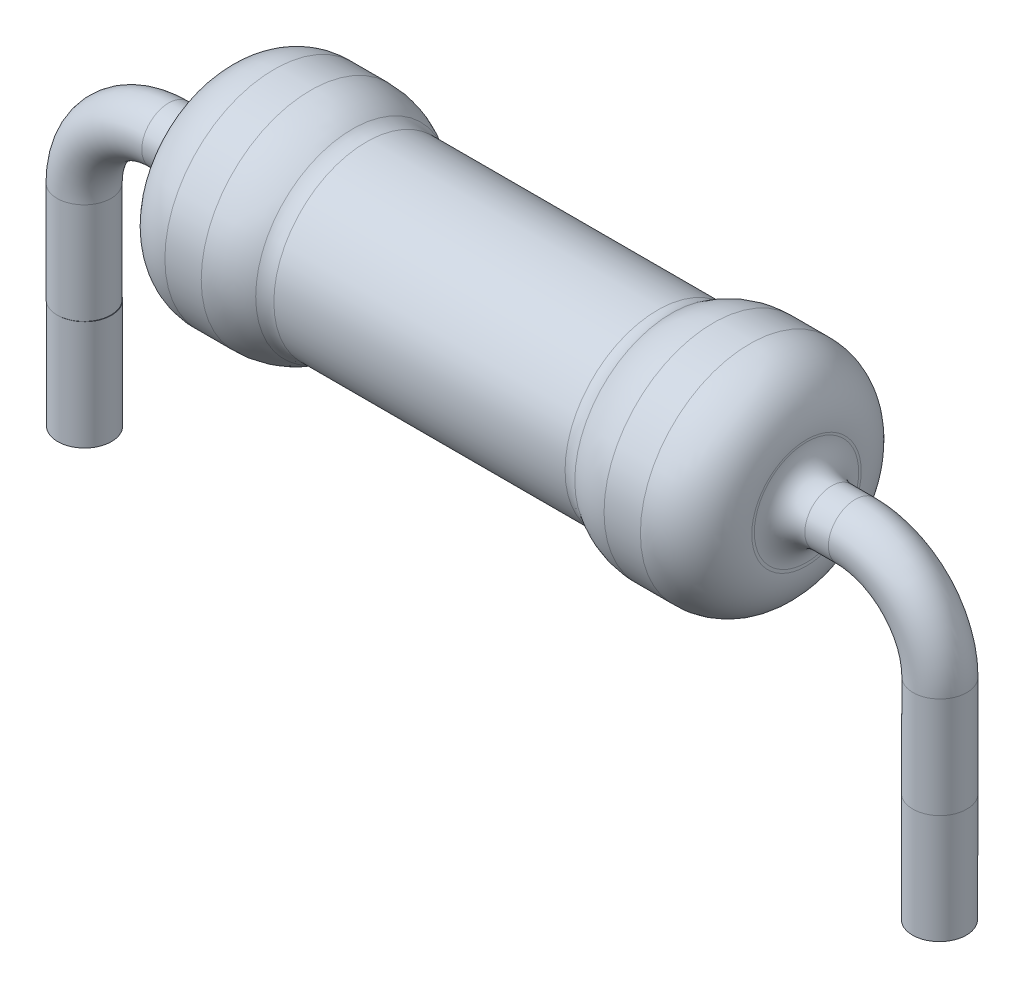
ISO-10303-21;
HEADER;
FILE_DESCRIPTION(('STEP AP214'),'2;1');
FILE_NAME('part.step','',(''),(''),'','','');
FILE_SCHEMA(('AUTOMOTIVE_DESIGN { 1 0 10303 214 1 1 1 1 }'));
ENDSEC;
DATA;
#1=APPLICATION_CONTEXT('core data for automotive mechanical design processes');
#2=APPLICATION_PROTOCOL_DEFINITION('international standard','automotive_design',2000,#1);
#3=PRODUCT_CONTEXT('',#1,'mechanical');
#4=PRODUCT('Part','Part','',(#3));
#5=PRODUCT_RELATED_PRODUCT_CATEGORY('part','',(#4));
#6=PRODUCT_DEFINITION_FORMATION('','',#4);
#7=PRODUCT_DEFINITION_CONTEXT('part definition',#1,'design');
#8=PRODUCT_DEFINITION('design','',#6,#7);
#9=PRODUCT_DEFINITION_SHAPE('','',#8);
#10=(LENGTH_UNIT() NAMED_UNIT(*) SI_UNIT(.MILLI.,.METRE.));
#11=(NAMED_UNIT(*) PLANE_ANGLE_UNIT() SI_UNIT($,.RADIAN.));
#12=(NAMED_UNIT(*) SI_UNIT($,.STERADIAN.) SOLID_ANGLE_UNIT());
#13=UNCERTAINTY_MEASURE_WITH_UNIT(LENGTH_MEASURE(1.E-05),#10,'distance_accuracy_value','');
#14=(GEOMETRIC_REPRESENTATION_CONTEXT(3) GLOBAL_UNCERTAINTY_ASSIGNED_CONTEXT((#13)) GLOBAL_UNIT_ASSIGNED_CONTEXT((#10,
#11,#12)) REPRESENTATION_CONTEXT('',''));
#15=CARTESIAN_POINT('',(0.,0.,0.));
#16=DIRECTION('',(0.,0.,1.));
#17=DIRECTION('',(1.,0.,0.));
#18=AXIS2_PLACEMENT_3D('',#15,#16,#17);
#19=CARTESIAN_POINT('',(5.08,5.3,0.));
#20=DIRECTION('',(0.,-1.,0.));
#21=DIRECTION('',(0.,0.,-1.));
#22=AXIS2_PLACEMENT_3D('',#19,#20,#21);
#23=CYLINDRICAL_SURFACE('',#22,0.32);
#24=CARTESIAN_POINT('',(5.08595401109108,5.3,0.));
#25=DIRECTION('',(0.,1.,0.));
#26=DIRECTION('',(-0.0186014552957771,0.,0.999826977962127));
#27=AXIS2_PLACEMENT_3D('',#24,#25,#26);
#28=CIRCLE('',#27,0.32);
#29=CARTESIAN_POINT('',(5.08000111603339,5.3,0.319972319800025));
#30=VERTEX_POINT('',#29);
#31=CARTESIAN_POINT('',(5.40297700554554,5.3,0.));
#32=VERTEX_POINT('',#31);
#33=EDGE_CURVE('E109',#30,#32,#28,.T.);
#34=ORIENTED_EDGE('',*,*,#33,.F.);
#35=CARTESIAN_POINT('',(5.08,5.3,0.));
#36=DIRECTION('',(0.,-1.,0.));
#37=DIRECTION('',(0.,0.,1.));
#38=AXIS2_PLACEMENT_3D('',#35,#36,#37);
#39=CIRCLE('',#38,0.32);
#40=CARTESIAN_POINT('',(4.76297700554554,5.3,0.));
#41=VERTEX_POINT('',#40);
#42=EDGE_CURVE('E98',#30,#41,#39,.T.);
#43=ORIENTED_EDGE('',*,*,#42,.T.);
#44=CARTESIAN_POINT('',(5.08,5.3,0.));
#45=DIRECTION('',(0.,-1.,0.));
#46=DIRECTION('',(-1.,0.,-1.66793845883752E-13));
#47=AXIS2_PLACEMENT_3D('',#44,#45,#46);
#48=CIRCLE('',#47,0.32);
#49=CARTESIAN_POINT('',(5.08000051517671,5.3,-0.319972311682629));
#50=VERTEX_POINT('',#49);
#51=EDGE_CURVE('E92',#41,#50,#48,.T.);
#52=ORIENTED_EDGE('',*,*,#51,.T.);
#53=CARTESIAN_POINT('',(5.08595401109108,5.3,0.));
#54=DIRECTION('',(0.,1.,0.));
#55=DIRECTION('',(1.,0.,0.));
#56=AXIS2_PLACEMENT_3D('',#53,#54,#55);
#57=CIRCLE('',#56,0.32);
#58=EDGE_CURVE('E101',#32,#50,#57,.T.);
#59=ORIENTED_EDGE('',*,*,#58,.F.);
#60=EDGE_LOOP('',(#34,#43,#52,#59));
#61=FACE_BOUND('',#60,.T.);
#62=CARTESIAN_POINT('',(5.08,4.,0.));
#63=DIRECTION('',(0.,-1.,0.));
#64=DIRECTION('',(0.,0.,-1.));
#65=AXIS2_PLACEMENT_3D('',#62,#63,#64);
#66=CIRCLE('',#65,0.32);
#67=CARTESIAN_POINT('',(5.08,4.,-0.319999999999999));
#68=VERTEX_POINT('',#67);
#69=EDGE_CURVE('E45',#68,#68,#66,.F.);
#70=ORIENTED_EDGE('',*,*,#69,.T.);
#71=EDGE_LOOP('',(#70));
#72=FACE_BOUND('',#71,.T.);
#73=ADVANCED_FACE('F41',(#61,#72),#23,.T.);
#74=CARTESIAN_POINT('',(-5.08595401109108,5.3,0.));
#75=DIRECTION('',(0.,1.,0.));
#76=DIRECTION('',(0.,0.,1.));
#77=AXIS2_PLACEMENT_3D('',#74,#75,#76);
#78=PLANE('',#77);
#79=CARTESIAN_POINT('',(-5.08595401109108,5.3,0.));
#80=DIRECTION('',(0.,-1.,0.));
#81=DIRECTION('',(1.,0.,0.));
#82=AXIS2_PLACEMENT_3D('',#79,#80,#81);
#83=CIRCLE('',#82,0.32);
#84=CARTESIAN_POINT('',(-4.76595401109108,5.3,0.));
#85=VERTEX_POINT('',#84);
#86=EDGE_CURVE('E231',#85,#85,#83,.F.);
#87=ORIENTED_EDGE('',*,*,#86,.F.);
#88=EDGE_LOOP('',(#87));
#89=FACE_BOUND('',#88,.T.);
#90=ADVANCED_FACE('F138',(#89),#78,.F.);
#91=CARTESIAN_POINT('',(5.08595401109108,6.5,0.));
#92=DIRECTION('',(0.,-1.,0.));
#93=DIRECTION('',(1.,0.,0.));
#94=AXIS2_PLACEMENT_3D('',#91,#92,#93);
#95=CYLINDRICAL_SURFACE('',#94,0.32);
#96=ORIENTED_EDGE('',*,*,#51,.F.);
#97=ORIENTED_EDGE('',*,*,#42,.F.);
#98=ORIENTED_EDGE('',*,*,#33,.T.);
#99=ORIENTED_EDGE('',*,*,#58,.T.);
#100=EDGE_LOOP('',(#96,#97,#98,#99));
#101=FACE_BOUND('',#100,.T.);
#102=CARTESIAN_POINT('',(5.08595401109107,6.5,0.));
#103=DIRECTION('',(0.,1.,0.));
#104=DIRECTION('',(1.,0.,0.));
#105=AXIS2_PLACEMENT_3D('',#102,#103,#104);
#106=CIRCLE('',#105,0.32);
#107=CARTESIAN_POINT('',(5.40595401109107,6.5,0.));
#108=VERTEX_POINT('',#107);
#109=EDGE_CURVE('E229',#108,#108,#106,.T.);
#110=ORIENTED_EDGE('',*,*,#109,.F.);
#111=EDGE_LOOP('',(#110));
#112=FACE_BOUND('',#111,.T.);
#113=ADVANCED_FACE('F95',(#101,#112),#95,.T.);
#114=CARTESIAN_POINT('',(-5.08595401109108,6.5,0.));
#115=DIRECTION('',(0.,-1.,0.));
#116=DIRECTION('',(1.,0.,0.));
#117=AXIS2_PLACEMENT_3D('',#114,#115,#116);
#118=CYLINDRICAL_SURFACE('',#117,0.32);
#119=CARTESIAN_POINT('',(-5.08595401109107,6.5,0.));
#120=DIRECTION('',(0.,1.,0.));
#121=DIRECTION('',(-1.,0.,0.));
#122=AXIS2_PLACEMENT_3D('',#119,#120,#121);
#123=CIRCLE('',#122,0.32);
#124=CARTESIAN_POINT('',(-5.40595401109107,6.5,0.));
#125=VERTEX_POINT('',#124);
#126=EDGE_CURVE('E226',#125,#125,#123,.T.);
#127=ORIENTED_EDGE('',*,*,#126,.F.);
#128=EDGE_LOOP('',(#127));
#129=FACE_BOUND('',#128,.T.);
#130=ORIENTED_EDGE('',*,*,#86,.T.);
#131=EDGE_LOOP('',(#130));
#132=FACE_BOUND('',#131,.T.);
#133=ADVANCED_FACE('F137',(#129,#132),#118,.T.);
#134=CARTESIAN_POINT('',(4.08,6.5,0.));
#135=DIRECTION('',(0.,0.,1.));
#136=DIRECTION('',(1.,0.,0.));
#137=AXIS2_PLACEMENT_3D('',#134,#135,#136);
#138=TOROIDAL_SURFACE('',#137,1.00595401109108,0.32);
#139=CARTESIAN_POINT('',(4.08,7.50595401109108,0.));
#140=DIRECTION('',(-1.,0.,0.));
#141=DIRECTION('',(0.,-1.,0.));
#142=AXIS2_PLACEMENT_3D('',#139,#140,#141);
#143=CIRCLE('',#142,0.32);
#144=CARTESIAN_POINT('',(4.08,7.18595401109108,0.));
#145=VERTEX_POINT('',#144);
#146=EDGE_CURVE('E212',#145,#145,#143,.T.);
#147=ORIENTED_EDGE('',*,*,#146,.F.);
#148=EDGE_LOOP('',(#147));
#149=FACE_BOUND('',#148,.T.);
#150=ORIENTED_EDGE('',*,*,#109,.T.);
#151=EDGE_LOOP('',(#150));
#152=FACE_BOUND('',#151,.T.);
#153=ADVANCED_FACE('F220',(#149,#152),#138,.T.);
#154=CARTESIAN_POINT('',(-4.08,6.5,0.));
#155=DIRECTION('',(0.,0.,-1.));
#156=DIRECTION('',(-1.,0.,0.));
#157=AXIS2_PLACEMENT_3D('',#154,#155,#156);
#158=TOROIDAL_SURFACE('',#157,1.00595401109108,0.32);
#159=CARTESIAN_POINT('',(-4.08,7.50595401109108,0.));
#160=DIRECTION('',(1.,0.,0.));
#161=DIRECTION('',(0.,1.,0.));
#162=AXIS2_PLACEMENT_3D('',#159,#160,#161);
#163=CIRCLE('',#162,0.320000000000001);
#164=CARTESIAN_POINT('',(-4.08,7.82595401109108,0.));
#165=VERTEX_POINT('',#164);
#166=EDGE_CURVE('E209',#165,#165,#163,.T.);
#167=ORIENTED_EDGE('',*,*,#166,.F.);
#168=EDGE_LOOP('',(#167));
#169=FACE_BOUND('',#168,.T.);
#170=ORIENTED_EDGE('',*,*,#126,.T.);
#171=EDGE_LOOP('',(#170));
#172=FACE_BOUND('',#171,.T.);
#173=ADVANCED_FACE('F217',(#169,#172),#158,.T.);
#174=CARTESIAN_POINT('',(4.08,7.50595401109108,0.));
#175=DIRECTION('',(-1.,0.,0.));
#176=DIRECTION('',(0.,-1.,0.));
#177=AXIS2_PLACEMENT_3D('',#174,#175,#176);
#178=CYLINDRICAL_SURFACE('',#177,0.32);
#179=CARTESIAN_POINT('',(3.8,7.50595401109108,0.));
#180=DIRECTION('',(1.,0.,0.));
#181=DIRECTION('',(0.,0.,-1.));
#182=AXIS2_PLACEMENT_3D('',#179,#180,#181);
#183=CIRCLE('',#182,0.32);
#184=CARTESIAN_POINT('',(3.8,7.50595401109108,-0.32));
#185=VERTEX_POINT('',#184);
#186=EDGE_CURVE('E206',#185,#185,#183,.T.);
#187=ORIENTED_EDGE('',*,*,#186,.T.);
#188=EDGE_LOOP('',(#187));
#189=FACE_BOUND('',#188,.T.);
#190=ORIENTED_EDGE('',*,*,#146,.T.);
#191=EDGE_LOOP('',(#190));
#192=FACE_BOUND('',#191,.T.);
#193=ADVANCED_FACE('F219',(#189,#192),#178,.T.);
#194=CARTESIAN_POINT('',(-4.08,7.50595401109108,0.));
#195=DIRECTION('',(1.,0.,0.));
#196=DIRECTION('',(0.,1.,0.));
#197=AXIS2_PLACEMENT_3D('',#194,#195,#196);
#198=CYLINDRICAL_SURFACE('',#197,0.320000000000001);
#199=ORIENTED_EDGE('',*,*,#166,.T.);
#200=EDGE_LOOP('',(#199));
#201=FACE_BOUND('',#200,.T.);
#202=CARTESIAN_POINT('',(-3.8,7.50595401109108,0.));
#203=DIRECTION('',(1.,0.,0.));
#204=DIRECTION('',(0.,0.,-1.));
#205=AXIS2_PLACEMENT_3D('',#202,#203,#204);
#206=CIRCLE('',#205,0.32);
#207=CARTESIAN_POINT('',(-3.8,7.50595401109108,-0.32));
#208=VERTEX_POINT('',#207);
#209=EDGE_CURVE('E197',#208,#208,#206,.F.);
#210=ORIENTED_EDGE('',*,*,#209,.T.);
#211=EDGE_LOOP('',(#210));
#212=FACE_BOUND('',#211,.T.);
#213=ADVANCED_FACE('F176',(#201,#212),#198,.T.);
#214=CARTESIAN_POINT('',(3.8,7.50595401109108,0.));
#215=DIRECTION('',(1.,0.,0.));
#216=DIRECTION('',(0.,0.,-1.));
#217=AXIS2_PLACEMENT_3D('',#214,#215,#216);
#218=TOROIDAL_SURFACE('',#217,0.62,0.3);
#219=ORIENTED_EDGE('',*,*,#186,.F.);
#220=EDGE_LOOP('',(#219));
#221=FACE_BOUND('',#220,.T.);
#222=CARTESIAN_POINT('',(3.5,7.50595401109108,0.));
#223=DIRECTION('',(1.,0.,0.));
#224=DIRECTION('',(0.,0.,1.));
#225=AXIS2_PLACEMENT_3D('',#222,#223,#224);
#226=CIRCLE('',#225,0.62);
#227=CARTESIAN_POINT('',(3.5,7.50595401109108,-0.62));
#228=VERTEX_POINT('',#227);
#229=CARTESIAN_POINT('',(3.5,7.50595401109108,0.62));
#230=VERTEX_POINT('',#229);
#231=EDGE_CURVE('E205',#228,#230,#226,.F.);
#232=ORIENTED_EDGE('',*,*,#231,.F.);
#233=CARTESIAN_POINT('',(3.5,7.50595401109108,0.));
#234=DIRECTION('',(1.,0.,0.));
#235=DIRECTION('',(0.,0.,-1.));
#236=AXIS2_PLACEMENT_3D('',#233,#234,#235);
#237=CIRCLE('',#236,0.62);
#238=EDGE_CURVE('E192',#230,#228,#237,.F.);
#239=ORIENTED_EDGE('',*,*,#238,.F.);
#240=EDGE_LOOP('',(#232,#239));
#241=FACE_BOUND('',#240,.T.);
#242=ADVANCED_FACE('F164',(#221,#241),#218,.F.);
#243=CARTESIAN_POINT('',(-3.8,7.50595401109108,0.));
#244=DIRECTION('',(1.,0.,0.));
#245=DIRECTION('',(0.,0.,-1.));
#246=AXIS2_PLACEMENT_3D('',#243,#244,#245);
#247=TOROIDAL_SURFACE('',#246,0.62,0.3);
#248=CARTESIAN_POINT('',(-3.5,7.50595401109108,0.));
#249=DIRECTION('',(-1.,0.,0.));
#250=DIRECTION('',(0.,0.,1.));
#251=AXIS2_PLACEMENT_3D('',#248,#249,#250);
#252=CIRCLE('',#251,0.62);
#253=CARTESIAN_POINT('',(-3.5,7.50595401109108,0.62));
#254=VERTEX_POINT('',#253);
#255=CARTESIAN_POINT('',(-3.5,7.50595401109108,-0.62));
#256=VERTEX_POINT('',#255);
#257=EDGE_CURVE('E376',#254,#256,#252,.T.);
#258=ORIENTED_EDGE('',*,*,#257,.T.);
#259=CARTESIAN_POINT('',(-3.5,7.50595401109108,0.));
#260=DIRECTION('',(-1.,0.,0.));
#261=DIRECTION('',(0.,0.,-1.));
#262=AXIS2_PLACEMENT_3D('',#259,#260,#261);
#263=CIRCLE('',#262,0.62);
#264=EDGE_CURVE('E273',#256,#254,#263,.T.);
#265=ORIENTED_EDGE('',*,*,#264,.T.);
#266=EDGE_LOOP('',(#258,#265));
#267=FACE_BOUND('',#266,.T.);
#268=ORIENTED_EDGE('',*,*,#209,.F.);
#269=EDGE_LOOP('',(#268));
#270=FACE_BOUND('',#269,.T.);
#271=ADVANCED_FACE('F175',(#267,#270),#247,.F.);
#272=CARTESIAN_POINT('',(3.5,0.,0.));
#273=DIRECTION('',(1.,0.,0.));
#274=DIRECTION('',(0.,0.,-1.));
#275=AXIS2_PLACEMENT_3D('',#272,#273,#274);
#276=PLANE('',#275);
#277=CARTESIAN_POINT('',(3.5,7.50030887078089,0.));
#278=DIRECTION('',(-1.,0.,0.));
#279=DIRECTION('',(0.,0.,1.));
#280=AXIS2_PLACEMENT_3D('',#277,#278,#279);
#281=CIRCLE('',#280,0.650453186138384);
#282=CARTESIAN_POINT('',(3.5,7.50030887078089,0.650453186138384));
#283=VERTEX_POINT('',#282);
#284=CARTESIAN_POINT('',(3.5,7.50030887078089,-0.650453186138384));
#285=VERTEX_POINT('',#284);
#286=EDGE_CURVE('E346',#283,#285,#281,.T.);
#287=ORIENTED_EDGE('',*,*,#286,.F.);
#288=CARTESIAN_POINT('',(3.5,7.50030887078089,0.));
#289=DIRECTION('',(-1.,0.,0.));
#290=DIRECTION('',(0.,0.,-1.));
#291=AXIS2_PLACEMENT_3D('',#288,#289,#290);
#292=CIRCLE('',#291,0.650453186138384);
#293=EDGE_CURVE('E356',#285,#283,#292,.T.);
#294=ORIENTED_EDGE('',*,*,#293,.F.);
#295=EDGE_LOOP('',(#287,#294));
#296=FACE_BOUND('',#295,.T.);
#297=ORIENTED_EDGE('',*,*,#231,.T.);
#298=ORIENTED_EDGE('',*,*,#238,.T.);
#299=EDGE_LOOP('',(#297,#298));
#300=FACE_BOUND('',#299,.T.);
#301=ADVANCED_FACE('F286',(#296,#300),#276,.T.);
#302=CARTESIAN_POINT('',(-3.5,0.,0.));
#303=DIRECTION('',(1.,0.,0.));
#304=DIRECTION('',(0.,0.,-1.));
#305=AXIS2_PLACEMENT_3D('',#302,#303,#304);
#306=PLANE('',#305);
#307=CARTESIAN_POINT('',(-3.5,7.50030887078089,0.));
#308=DIRECTION('',(1.,0.,0.));
#309=DIRECTION('',(0.,0.,1.));
#310=AXIS2_PLACEMENT_3D('',#307,#308,#309);
#311=CIRCLE('',#310,0.650453186138384);
#312=CARTESIAN_POINT('',(-3.5,7.50030887078089,0.650453186138384));
#313=VERTEX_POINT('',#312);
#314=CARTESIAN_POINT('',(-3.5,7.50030887078089,-0.650453186138384));
#315=VERTEX_POINT('',#314);
#316=EDGE_CURVE('E59',#313,#315,#311,.T.);
#317=ORIENTED_EDGE('',*,*,#316,.F.);
#318=CARTESIAN_POINT('',(-3.5,7.50030887078089,0.));
#319=DIRECTION('',(1.,0.,0.));
#320=DIRECTION('',(0.,0.,-1.));
#321=AXIS2_PLACEMENT_3D('',#318,#319,#320);
#322=CIRCLE('',#321,0.650453186138384);
#323=EDGE_CURVE('E303',#315,#313,#322,.T.);
#324=ORIENTED_EDGE('',*,*,#323,.F.);
#325=EDGE_LOOP('',(#317,#324));
#326=FACE_BOUND('',#325,.T.);
#327=ORIENTED_EDGE('',*,*,#264,.F.);
#328=ORIENTED_EDGE('',*,*,#257,.F.);
#329=EDGE_LOOP('',(#327,#328));
#330=FACE_BOUND('',#329,.T.);
#331=ADVANCED_FACE('F278',(#326,#330),#306,.F.);
#332=CARTESIAN_POINT('',(2.85,7.50030887078089,0.));
#333=DIRECTION('',(-1.,0.,0.));
#334=DIRECTION('',(0.,0.,1.));
#335=AXIS2_PLACEMENT_3D('',#332,#333,#334);
#336=TOROIDAL_SURFACE('',#335,0.650453186138384,0.65);
#337=CARTESIAN_POINT('',(2.82573198396603,7.50030887078089,0.));
#338=DIRECTION('',(-1.,0.,0.));
#339=DIRECTION('',(0.,0.,1.));
#340=AXIS2_PLACEMENT_3D('',#337,#338,#339);
#341=CIRCLE('',#340,1.3);
#342=CARTESIAN_POINT('',(2.82573198396603,7.50030887078089,1.3));
#343=VERTEX_POINT('',#342);
#344=EDGE_CURVE('E265',#343,#343,#341,.T.);
#345=ORIENTED_EDGE('',*,*,#344,.F.);
#346=EDGE_LOOP('',(#345));
#347=FACE_BOUND('',#346,.T.);
#348=ORIENTED_EDGE('',*,*,#286,.T.);
#349=ORIENTED_EDGE('',*,*,#293,.T.);
#350=EDGE_LOOP('',(#348,#349));
#351=FACE_BOUND('',#350,.T.);
#352=ADVANCED_FACE('F256',(#347,#351),#336,.T.);
#353=CARTESIAN_POINT('',(-2.85,7.50030887078089,0.));
#354=DIRECTION('',(-1.,0.,0.));
#355=DIRECTION('',(0.,0.,1.));
#356=AXIS2_PLACEMENT_3D('',#353,#354,#355);
#357=TOROIDAL_SURFACE('',#356,0.650453186138384,0.65);
#358=ORIENTED_EDGE('',*,*,#316,.T.);
#359=ORIENTED_EDGE('',*,*,#323,.T.);
#360=EDGE_LOOP('',(#358,#359));
#361=FACE_BOUND('',#360,.T.);
#362=CARTESIAN_POINT('',(-2.82573198396603,7.50030887078089,0.));
#363=DIRECTION('',(-1.,0.,0.));
#364=DIRECTION('',(0.,0.,1.));
#365=AXIS2_PLACEMENT_3D('',#362,#363,#364);
#366=CIRCLE('',#365,1.3);
#367=CARTESIAN_POINT('',(-2.82573198396603,7.50030887078089,1.3));
#368=VERTEX_POINT('',#367);
#369=EDGE_CURVE('E315',#368,#368,#366,.F.);
#370=ORIENTED_EDGE('',*,*,#369,.F.);
#371=EDGE_LOOP('',(#370));
#372=FACE_BOUND('',#371,.T.);
#373=ADVANCED_FACE('F244',(#361,#372),#357,.T.);
#374=CARTESIAN_POINT('',(-3.5,7.50030887078089,0.));
#375=DIRECTION('',(-1.,0.,0.));
#376=DIRECTION('',(0.,0.,1.));
#377=AXIS2_PLACEMENT_3D('',#374,#375,#376);
#378=CYLINDRICAL_SURFACE('',#377,1.3);
#379=CARTESIAN_POINT('',(2.39370640790275,7.50030887078089,0.));
#380=DIRECTION('',(-1.,0.,0.));
#381=DIRECTION('',(0.,0.,1.));
#382=AXIS2_PLACEMENT_3D('',#379,#380,#381);
#383=CIRCLE('',#382,1.3);
#384=CARTESIAN_POINT('',(2.39370640790275,7.50030887078089,1.3));
#385=VERTEX_POINT('',#384);
#386=EDGE_CURVE('E323',#385,#385,#383,.T.);
#387=ORIENTED_EDGE('',*,*,#386,.F.);
#388=EDGE_LOOP('',(#387));
#389=FACE_BOUND('',#388,.T.);
#390=ORIENTED_EDGE('',*,*,#344,.T.);
#391=EDGE_LOOP('',(#390));
#392=FACE_BOUND('',#391,.T.);
#393=ADVANCED_FACE('F255',(#389,#392),#378,.T.);
#394=CARTESIAN_POINT('',(-3.5,7.50030887078089,0.));
#395=DIRECTION('',(-1.,0.,0.));
#396=DIRECTION('',(0.,0.,1.));
#397=AXIS2_PLACEMENT_3D('',#394,#395,#396);
#398=CYLINDRICAL_SURFACE('',#397,1.3);
#399=ORIENTED_EDGE('',*,*,#369,.T.);
#400=EDGE_LOOP('',(#399));
#401=FACE_BOUND('',#400,.T.);
#402=CARTESIAN_POINT('',(-2.39370640790275,7.50030887078089,0.));
#403=DIRECTION('',(-1.,0.,0.));
#404=DIRECTION('',(0.,0.,1.));
#405=AXIS2_PLACEMENT_3D('',#402,#403,#404);
#406=CIRCLE('',#405,1.3);
#407=CARTESIAN_POINT('',(-2.39370640790275,7.50030887078089,1.3));
#408=VERTEX_POINT('',#407);
#409=EDGE_CURVE('E421',#408,#408,#406,.F.);
#410=ORIENTED_EDGE('',*,*,#409,.F.);
#411=EDGE_LOOP('',(#410));
#412=FACE_BOUND('',#411,.T.);
#413=ADVANCED_FACE('F431',(#401,#412),#398,.T.);
#414=CARTESIAN_POINT('',(2.39370640790275,7.50030887078089,0.4));
#415=DIRECTION('',(0.,1.,0.));
#416=DIRECTION('',(0.,0.,1.));
#417=AXIS2_PLACEMENT_3D('',#414,#415,#416);
#418=CIRCLE('',#417,0.899999999999999);
#419=TRIMMED_CURVE('',#418,(PARAMETER_VALUE(-2.03135031847622)),
(PARAMETER_VALUE(2.03135031847622)),.T.,.PARAMETER.);
#420=CARTESIAN_POINT('',(2.39370640790275,7.50030887078089,0.));
#421=DIRECTION('',(-1.,0.,0.));
#422=AXIS1_PLACEMENT('',#420,#421);
#423=SURFACE_OF_REVOLUTION('',#419,#422);
#424=CARTESIAN_POINT('',(1.89621268934944,7.50030887078089,0.));
#425=DIRECTION('',(-1.,0.,0.));
#426=DIRECTION('',(0.,0.,1.));
#427=AXIS2_PLACEMENT_3D('',#424,#425,#426);
#428=CIRCLE('',#427,1.15);
#429=CARTESIAN_POINT('',(1.89621268934944,7.50030887078089,1.15));
#430=VERTEX_POINT('',#429);
#431=EDGE_CURVE('E416',#430,#430,#428,.F.);
#432=ORIENTED_EDGE('',*,*,#431,.T.);
#433=EDGE_LOOP('',(#432));
#434=FACE_BOUND('',#433,.T.);
#435=ORIENTED_EDGE('',*,*,#386,.T.);
#436=EDGE_LOOP('',(#435));
#437=FACE_BOUND('',#436,.T.);
#438=ADVANCED_FACE('F428',(#434,#437),#423,.F.);
#439=CARTESIAN_POINT('',(-2.39370640790275,7.50030887078089,0.4));
#440=DIRECTION('',(0.,1.,0.));
#441=DIRECTION('',(0.,0.,1.));
#442=AXIS2_PLACEMENT_3D('',#439,#440,#441);
#443=CIRCLE('',#442,0.899999999999999);
#444=TRIMMED_CURVE('',#443,(PARAMETER_VALUE(-2.03135031847622)),
(PARAMETER_VALUE(2.03135031847622)),.T.,.PARAMETER.);
#445=CARTESIAN_POINT('',(-2.39370640790275,7.50030887078089,0.));
#446=DIRECTION('',(-1.,0.,0.));
#447=AXIS1_PLACEMENT('',#445,#446);
#448=SURFACE_OF_REVOLUTION('',#444,#447);
#449=ORIENTED_EDGE('',*,*,#409,.T.);
#450=EDGE_LOOP('',(#449));
#451=FACE_BOUND('',#450,.T.);
#452=CARTESIAN_POINT('',(-1.89621268934944,7.50030887078089,0.));
#453=DIRECTION('',(-1.,0.,0.));
#454=DIRECTION('',(0.,0.,1.));
#455=AXIS2_PLACEMENT_3D('',#452,#453,#454);
#456=CIRCLE('',#455,1.15);
#457=CARTESIAN_POINT('',(-1.89621268934944,7.50030887078089,1.15));
#458=VERTEX_POINT('',#457);
#459=EDGE_CURVE('E414',#458,#458,#456,.T.);
#460=ORIENTED_EDGE('',*,*,#459,.T.);
#461=EDGE_LOOP('',(#460));
#462=FACE_BOUND('',#461,.T.);
#463=ADVANCED_FACE('F425',(#451,#462),#448,.F.);
#464=CARTESIAN_POINT('',(1.73038144983167,7.50030887078089,0.));
#465=DIRECTION('',(-1.,0.,0.));
#466=DIRECTION('',(0.,0.,1.));
#467=AXIS2_PLACEMENT_3D('',#464,#465,#466);
#468=TOROIDAL_SURFACE('',#467,1.4,0.3);
#469=CARTESIAN_POINT('',(1.73038144983167,7.50030887078089,0.));
#470=DIRECTION('',(-1.,0.,0.));
#471=DIRECTION('',(0.,0.,1.));
#472=AXIS2_PLACEMENT_3D('',#469,#470,#471);
#473=CIRCLE('',#472,1.1);
#474=CARTESIAN_POINT('',(1.73038144983167,7.50030887078089,1.1));
#475=VERTEX_POINT('',#474);
#476=EDGE_CURVE('E51',#475,#475,#473,.T.);
#477=ORIENTED_EDGE('',*,*,#476,.F.);
#478=EDGE_LOOP('',(#477));
#479=FACE_BOUND('',#478,.T.);
#480=ORIENTED_EDGE('',*,*,#431,.F.);
#481=EDGE_LOOP('',(#480));
#482=FACE_BOUND('',#481,.T.);
#483=ADVANCED_FACE('F403',(#479,#482),#468,.F.);
#484=CARTESIAN_POINT('',(-1.73038144983167,7.50030887078089,0.));
#485=DIRECTION('',(-1.,0.,0.));
#486=DIRECTION('',(0.,0.,1.));
#487=AXIS2_PLACEMENT_3D('',#484,#485,#486);
#488=TOROIDAL_SURFACE('',#487,1.4,0.3);
#489=ORIENTED_EDGE('',*,*,#459,.F.);
#490=EDGE_LOOP('',(#489));
#491=FACE_BOUND('',#490,.T.);
#492=CARTESIAN_POINT('',(-1.73038144983167,7.50030887078089,0.));
#493=DIRECTION('',(-1.,0.,0.));
#494=DIRECTION('',(0.,0.,1.));
#495=AXIS2_PLACEMENT_3D('',#492,#493,#494);
#496=CIRCLE('',#495,1.1);
#497=CARTESIAN_POINT('',(-1.73038144983167,7.50030887078089,1.1));
#498=VERTEX_POINT('',#497);
#499=EDGE_CURVE('E12',#498,#498,#496,.F.);
#500=ORIENTED_EDGE('',*,*,#499,.F.);
#501=EDGE_LOOP('',(#500));
#502=FACE_BOUND('',#501,.T.);
#503=ADVANCED_FACE('F394',(#491,#502),#488,.F.);
#504=CARTESIAN_POINT('',(-3.5,7.50030887078089,0.));
#505=DIRECTION('',(-1.,0.,0.));
#506=DIRECTION('',(0.,0.,1.));
#507=AXIS2_PLACEMENT_3D('',#504,#505,#506);
#508=CYLINDRICAL_SURFACE('',#507,1.1);
#509=ORIENTED_EDGE('',*,*,#499,.T.);
#510=EDGE_LOOP('',(#509));
#511=FACE_BOUND('',#510,.T.);
#512=ORIENTED_EDGE('',*,*,#476,.T.);
#513=EDGE_LOOP('',(#512));
#514=FACE_BOUND('',#513,.T.);
#515=ADVANCED_FACE('F387',(#511,#514),#508,.T.);
#516=CARTESIAN_POINT('',(-6.83012850521312,4.,-2.39161817568562));
#517=DIRECTION('',(0.,-1.,0.));
#518=DIRECTION('',(0.,0.,-1.));
#519=AXIS2_PLACEMENT_3D('',#516,#517,#518);
#520=PLANE('',#519);
#521=ORIENTED_EDGE('',*,*,#69,.F.);
#522=EDGE_LOOP('',(#521));
#523=FACE_BOUND('',#522,.T.);
#524=ADVANCED_FACE('F392',(#523),#520,.T.);
#525=CLOSED_SHELL('',(#73,#90,#113,#133,#153,#173,#193,#213,#242,#271,#301,#331,#352,#373,#393,
#413,#438,#463,#483,#503,#515,#524));
#526=MANIFOLD_SOLID_BREP('B2',#525);
#527=CARTESIAN_POINT('',(-5.08,5.3,0.));
#528=DIRECTION('',(0.,-1.,0.));
#529=DIRECTION('',(0.,0.,-1.));
#530=AXIS2_PLACEMENT_3D('',#527,#528,#529);
#531=CYLINDRICAL_SURFACE('',#530,0.32);
#532=CARTESIAN_POINT('',(-5.08,5.3,0.));
#533=DIRECTION('',(0.,-1.,0.));
#534=DIRECTION('',(0.,0.,-1.));
#535=AXIS2_PLACEMENT_3D('',#532,#533,#534);
#536=CIRCLE('',#535,0.32);
#537=CARTESIAN_POINT('',(-5.08,5.3,-0.319999999999999));
#538=VERTEX_POINT('',#537);
#539=EDGE_CURVE('E40',#538,#538,#536,.T.);
#540=ORIENTED_EDGE('',*,*,#539,.T.);
#541=EDGE_LOOP('',(#540));
#542=FACE_BOUND('',#541,.T.);
#543=CARTESIAN_POINT('',(-5.08,4.,0.));
#544=DIRECTION('',(0.,-1.,0.));
#545=DIRECTION('',(0.,0.,-1.));
#546=AXIS2_PLACEMENT_3D('',#543,#544,#545);
#547=CIRCLE('',#546,0.32);
#548=CARTESIAN_POINT('',(-5.08,4.,-0.319999999999999));
#549=VERTEX_POINT('',#548);
#550=EDGE_CURVE('E711',#549,#549,#547,.F.);
#551=ORIENTED_EDGE('',*,*,#550,.T.);
#552=EDGE_LOOP('',(#551));
#553=FACE_BOUND('',#552,.T.);
#554=ADVANCED_FACE('F707',(#542,#553),#531,.T.);
#555=CARTESIAN_POINT('',(-5.08,5.3,0.));
#556=DIRECTION('',(0.,1.,0.));
#557=DIRECTION('',(0.,0.,1.));
#558=AXIS2_PLACEMENT_3D('',#555,#556,#557);
#559=PLANE('',#558);
#560=ORIENTED_EDGE('',*,*,#539,.F.);
#561=EDGE_LOOP('',(#560));
#562=FACE_BOUND('',#561,.T.);
#563=ADVANCED_FACE('F709',(#562),#559,.T.);
#564=CARTESIAN_POINT('',(-6.83012850521312,4.,-2.39161817568562));
#565=DIRECTION('',(0.,-1.,0.));
#566=DIRECTION('',(0.,0.,-1.));
#567=AXIS2_PLACEMENT_3D('',#564,#565,#566);
#568=PLANE('',#567);
#569=ORIENTED_EDGE('',*,*,#550,.F.);
#570=EDGE_LOOP('',(#569));
#571=FACE_BOUND('',#570,.T.);
#572=ADVANCED_FACE('F721',(#571),#568,.T.);
#573=CLOSED_SHELL('',(#554,#563,#572));
#574=MANIFOLD_SOLID_BREP('B6',#573);
#575=ADVANCED_BREP_SHAPE_REPRESENTATION('',(#18,#526,#574),#14);
#576=SHAPE_DEFINITION_REPRESENTATION(#9,#575);
ENDSEC;
END-ISO-10303-21;
